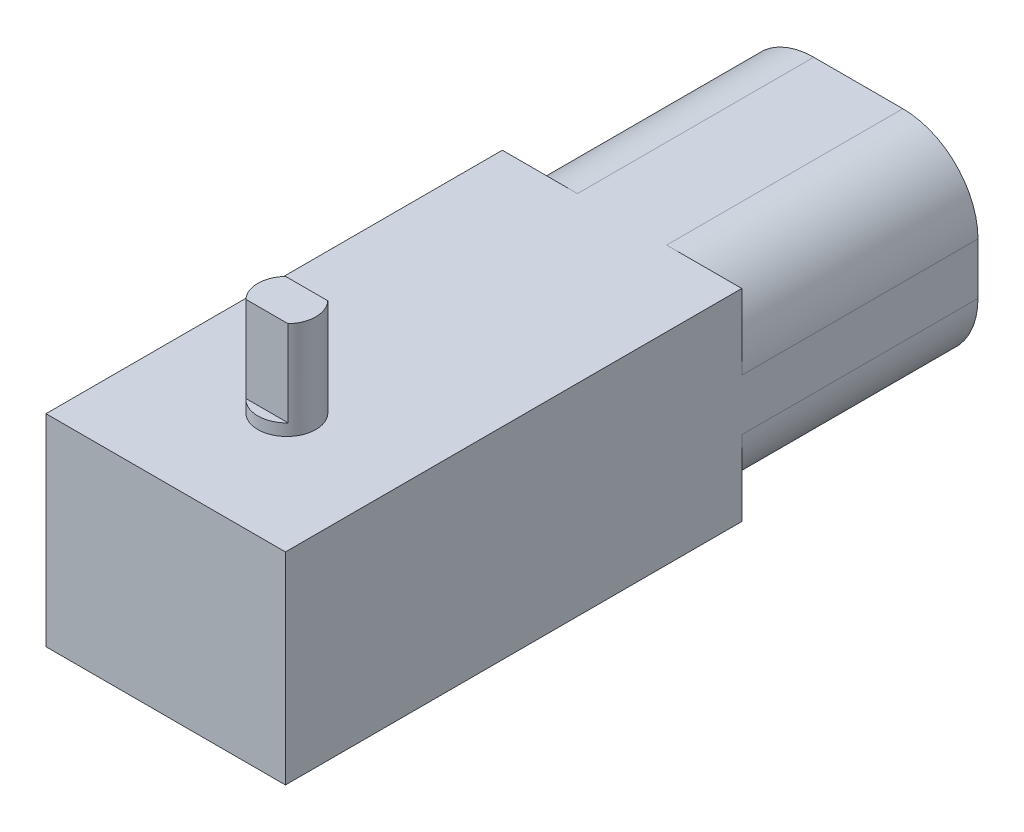
ISO-10303-21;
HEADER;
FILE_DESCRIPTION(('STEP AP214'),'2;1');
FILE_NAME('part.step','',(''),(''),'','','');
FILE_SCHEMA(('AUTOMOTIVE_DESIGN { 1 0 10303 214 1 1 1 1 }'));
ENDSEC;
DATA;
#1=APPLICATION_CONTEXT('core data for automotive mechanical design processes');
#2=APPLICATION_PROTOCOL_DEFINITION('international standard','automotive_design',2000,#1);
#3=PRODUCT_CONTEXT('',#1,'mechanical');
#4=PRODUCT('Part','Part','',(#3));
#5=PRODUCT_RELATED_PRODUCT_CATEGORY('part','',(#4));
#6=PRODUCT_DEFINITION_FORMATION('','',#4);
#7=PRODUCT_DEFINITION_CONTEXT('part definition',#1,'design');
#8=PRODUCT_DEFINITION('design','',#6,#7);
#9=PRODUCT_DEFINITION_SHAPE('','',#8);
#10=(LENGTH_UNIT() NAMED_UNIT(*) SI_UNIT(.MILLI.,.METRE.));
#11=(NAMED_UNIT(*) PLANE_ANGLE_UNIT() SI_UNIT($,.RADIAN.));
#12=(NAMED_UNIT(*) SI_UNIT($,.STERADIAN.) SOLID_ANGLE_UNIT());
#13=UNCERTAINTY_MEASURE_WITH_UNIT(LENGTH_MEASURE(1.E-05),#10,'distance_accuracy_value','');
#14=(GEOMETRIC_REPRESENTATION_CONTEXT(3) GLOBAL_UNCERTAINTY_ASSIGNED_CONTEXT((#13)) GLOBAL_UNIT_ASSIGNED_CONTEXT((#10,
#11,#12)) REPRESENTATION_CONTEXT('',''));
#15=CARTESIAN_POINT('',(0.,0.,0.));
#16=DIRECTION('',(0.,0.,1.));
#17=DIRECTION('',(1.,0.,0.));
#18=AXIS2_PLACEMENT_3D('',#15,#16,#17);
#19=CARTESIAN_POINT('',(-11.15,18.8,-32.25));
#20=DIRECTION('',(0.,0.,1.));
#21=DIRECTION('',(1.,0.,0.));
#22=AXIS2_PLACEMENT_3D('',#19,#20,#21);
#23=PLANE('',#22);
#24=DIRECTION('',(0.,-1.,0.));
#25=VECTOR('',#24,1.);
#26=CARTESIAN_POINT('',(-11.15,18.8,-32.25));
#27=LINE('',#26,#25);
#28=CARTESIAN_POINT('',(-11.15,11.8,-32.25));
#29=VERTEX_POINT('',#28);
#30=CARTESIAN_POINT('',(-11.15,7.00000000000005,-32.25));
#31=VERTEX_POINT('',#30);
#32=EDGE_CURVE('E265',#29,#31,#27,.T.);
#33=ORIENTED_EDGE('',*,*,#32,.F.);
#34=CARTESIAN_POINT('',(-4.15,11.8,-32.25));
#35=DIRECTION('',(0.,0.,-1.));
#36=DIRECTION('',(-1.,0.,0.));
#37=AXIS2_PLACEMENT_3D('',#34,#35,#36);
#38=CIRCLE('',#37,7.);
#39=CARTESIAN_POINT('',(-4.14999999999995,18.8,-32.25));
#40=VERTEX_POINT('',#39);
#41=EDGE_CURVE('E166',#40,#29,#38,.F.);
#42=ORIENTED_EDGE('',*,*,#41,.F.);
#43=DIRECTION('',(-1.,0.,0.));
#44=VECTOR('',#43,1.);
#45=CARTESIAN_POINT('',(-11.15,18.8,-32.25));
#46=LINE('',#45,#44);
#47=CARTESIAN_POINT('',(4.14999999999995,18.8,-32.25));
#48=VERTEX_POINT('',#47);
#49=EDGE_CURVE('E172',#48,#40,#46,.T.);
#50=ORIENTED_EDGE('',*,*,#49,.F.);
#51=CARTESIAN_POINT('',(4.15,11.8,-32.25));
#52=DIRECTION('',(0.,0.,-1.));
#53=DIRECTION('',(-1.,0.,0.));
#54=AXIS2_PLACEMENT_3D('',#51,#52,#53);
#55=CIRCLE('',#54,7.);
#56=CARTESIAN_POINT('',(11.15,11.8,-32.25));
#57=VERTEX_POINT('',#56);
#58=EDGE_CURVE('E194',#57,#48,#55,.F.);
#59=ORIENTED_EDGE('',*,*,#58,.F.);
#60=DIRECTION('',(0.,-1.,0.));
#61=VECTOR('',#60,1.);
#62=CARTESIAN_POINT('',(11.15,18.8,-32.25));
#63=LINE('',#62,#61);
#64=CARTESIAN_POINT('',(11.15,7.00000000000005,-32.25));
#65=VERTEX_POINT('',#64);
#66=EDGE_CURVE('E267',#57,#65,#63,.T.);
#67=ORIENTED_EDGE('',*,*,#66,.T.);
#68=CARTESIAN_POINT('',(4.15,7.,-32.25));
#69=DIRECTION('',(0.,0.,-1.));
#70=DIRECTION('',(-1.,0.,0.));
#71=AXIS2_PLACEMENT_3D('',#68,#69,#70);
#72=CIRCLE('',#71,7.);
#73=CARTESIAN_POINT('',(4.14999999999995,0.,-32.25));
#74=VERTEX_POINT('',#73);
#75=EDGE_CURVE('E181',#74,#65,#72,.F.);
#76=ORIENTED_EDGE('',*,*,#75,.F.);
#77=DIRECTION('',(-1.,0.,0.));
#78=VECTOR('',#77,1.);
#79=CARTESIAN_POINT('',(-11.15,0.,-32.25));
#80=LINE('',#79,#78);
#81=CARTESIAN_POINT('',(-4.14999999999995,0.,-32.25));
#82=VERTEX_POINT('',#81);
#83=EDGE_CURVE('E255',#74,#82,#80,.T.);
#84=ORIENTED_EDGE('',*,*,#83,.T.);
#85=CARTESIAN_POINT('',(-4.15,7.,-32.25));
#86=DIRECTION('',(0.,0.,-1.));
#87=DIRECTION('',(-1.,0.,0.));
#88=AXIS2_PLACEMENT_3D('',#85,#86,#87);
#89=CIRCLE('',#88,7.);
#90=EDGE_CURVE('E174',#31,#82,#89,.F.);
#91=ORIENTED_EDGE('',*,*,#90,.F.);
#92=EDGE_LOOP('',(#33,#42,#50,#59,#67,#76,#84,#91));
#93=FACE_BOUND('',#92,.T.);
#94=ADVANCED_FACE('F37',(#93),#23,.F.);
#95=CARTESIAN_POINT('',(11.15,18.8,-32.25));
#96=DIRECTION('',(-1.,0.,0.));
#97=DIRECTION('',(0.,0.,1.));
#98=AXIS2_PLACEMENT_3D('',#95,#96,#97);
#99=PLANE('',#98);
#100=DIRECTION('',(0.,0.,-1.));
#101=VECTOR('',#100,1.);
#102=CARTESIAN_POINT('',(11.15,7.00000000000005,-10.25));
#103=LINE('',#102,#101);
#104=CARTESIAN_POINT('',(11.15,7.00000000000005,-10.25));
#105=VERTEX_POINT('',#104);
#106=EDGE_CURVE('E188',#105,#65,#103,.T.);
#107=ORIENTED_EDGE('',*,*,#106,.T.);
#108=ORIENTED_EDGE('',*,*,#66,.F.);
#109=DIRECTION('',(0.,0.,-1.));
#110=VECTOR('',#109,1.);
#111=CARTESIAN_POINT('',(11.15,11.8,-10.25));
#112=LINE('',#111,#110);
#113=CARTESIAN_POINT('',(11.15,11.8,-10.25));
#114=VERTEX_POINT('',#113);
#115=EDGE_CURVE('E198',#114,#57,#112,.T.);
#116=ORIENTED_EDGE('',*,*,#115,.F.);
#117=DIRECTION('',(0.,-1.,0.));
#118=VECTOR('',#117,1.);
#119=CARTESIAN_POINT('',(11.15,0.,-10.25));
#120=LINE('',#119,#118);
#121=CARTESIAN_POINT('',(11.15,18.8,-10.25));
#122=VERTEX_POINT('',#121);
#123=EDGE_CURVE('E192',#122,#114,#120,.T.);
#124=ORIENTED_EDGE('',*,*,#123,.F.);
#125=DIRECTION('',(0.,0.,-1.));
#126=VECTOR('',#125,1.);
#127=CARTESIAN_POINT('',(11.15,18.8,-32.25));
#128=LINE('',#127,#126);
#129=CARTESIAN_POINT('',(11.15,18.8,32.25));
#130=VERTEX_POINT('',#129);
#131=EDGE_CURVE('E243',#130,#122,#128,.T.);
#132=ORIENTED_EDGE('',*,*,#131,.F.);
#133=DIRECTION('',(0.,-1.,0.));
#134=VECTOR('',#133,1.);
#135=CARTESIAN_POINT('',(11.15,18.8,32.25));
#136=LINE('',#135,#134);
#137=CARTESIAN_POINT('',(11.15,0.,32.25));
#138=VERTEX_POINT('',#137);
#139=EDGE_CURVE('E252',#130,#138,#136,.T.);
#140=ORIENTED_EDGE('',*,*,#139,.T.);
#141=DIRECTION('',(0.,0.,-1.));
#142=VECTOR('',#141,1.);
#143=CARTESIAN_POINT('',(11.15,0.,-32.25));
#144=LINE('',#143,#142);
#145=CARTESIAN_POINT('',(11.15,0.,-10.25));
#146=VERTEX_POINT('',#145);
#147=EDGE_CURVE('E239',#138,#146,#144,.T.);
#148=ORIENTED_EDGE('',*,*,#147,.T.);
#149=DIRECTION('',(0.,-1.,0.));
#150=VECTOR('',#149,1.);
#151=CARTESIAN_POINT('',(11.15,0.,-10.25));
#152=LINE('',#151,#150);
#153=EDGE_CURVE('E183',#105,#146,#152,.T.);
#154=ORIENTED_EDGE('',*,*,#153,.F.);
#155=EDGE_LOOP('',(#107,#108,#116,#124,#132,#140,#148,#154));
#156=FACE_BOUND('',#155,.T.);
#157=ADVANCED_FACE('F39',(#156),#99,.F.);
#158=CARTESIAN_POINT('',(-11.15,18.8,-32.25));
#159=DIRECTION('',(1.,0.,0.));
#160=DIRECTION('',(0.,0.,-1.));
#161=AXIS2_PLACEMENT_3D('',#158,#159,#160);
#162=PLANE('',#161);
#163=DIRECTION('',(0.,0.,-1.));
#164=VECTOR('',#163,1.);
#165=CARTESIAN_POINT('',(-11.15,11.8,-10.25));
#166=LINE('',#165,#164);
#167=CARTESIAN_POINT('',(-11.15,11.8,-10.25));
#168=VERTEX_POINT('',#167);
#169=EDGE_CURVE('E156',#168,#29,#166,.T.);
#170=ORIENTED_EDGE('',*,*,#169,.T.);
#171=ORIENTED_EDGE('',*,*,#32,.T.);
#172=DIRECTION('',(0.,0.,-1.));
#173=VECTOR('',#172,1.);
#174=CARTESIAN_POINT('',(-11.15,7.00000000000005,-10.25));
#175=LINE('',#174,#173);
#176=CARTESIAN_POINT('',(-11.15,7.00000000000005,-10.25));
#177=VERTEX_POINT('',#176);
#178=EDGE_CURVE('E209',#177,#31,#175,.T.);
#179=ORIENTED_EDGE('',*,*,#178,.F.);
#180=DIRECTION('',(0.,1.,0.));
#181=VECTOR('',#180,1.);
#182=CARTESIAN_POINT('',(-11.15,0.,-10.25));
#183=LINE('',#182,#181);
#184=CARTESIAN_POINT('',(-11.15,0.,-10.25));
#185=VERTEX_POINT('',#184);
#186=EDGE_CURVE('E202',#185,#177,#183,.T.);
#187=ORIENTED_EDGE('',*,*,#186,.F.);
#188=DIRECTION('',(0.,0.,1.));
#189=VECTOR('',#188,1.);
#190=CARTESIAN_POINT('',(-11.15,0.,-32.25));
#191=LINE('',#190,#189);
#192=CARTESIAN_POINT('',(-11.15,0.,32.25));
#193=VERTEX_POINT('',#192);
#194=EDGE_CURVE('E257',#185,#193,#191,.T.);
#195=ORIENTED_EDGE('',*,*,#194,.T.);
#196=DIRECTION('',(0.,-1.,0.));
#197=VECTOR('',#196,1.);
#198=CARTESIAN_POINT('',(-11.15,18.8,32.25));
#199=LINE('',#198,#197);
#200=CARTESIAN_POINT('',(-11.15,18.8,32.25));
#201=VERTEX_POINT('',#200);
#202=EDGE_CURVE('E262',#201,#193,#199,.T.);
#203=ORIENTED_EDGE('',*,*,#202,.F.);
#204=DIRECTION('',(0.,0.,1.));
#205=VECTOR('',#204,1.);
#206=CARTESIAN_POINT('',(-11.15,18.8,-32.25));
#207=LINE('',#206,#205);
#208=CARTESIAN_POINT('',(-11.15,18.8,-10.25));
#209=VERTEX_POINT('',#208);
#210=EDGE_CURVE('E248',#209,#201,#207,.T.);
#211=ORIENTED_EDGE('',*,*,#210,.F.);
#212=DIRECTION('',(0.,1.,0.));
#213=VECTOR('',#212,1.);
#214=CARTESIAN_POINT('',(-11.15,0.,-10.25));
#215=LINE('',#214,#213);
#216=EDGE_CURVE('E159',#168,#209,#215,.T.);
#217=ORIENTED_EDGE('',*,*,#216,.F.);
#218=EDGE_LOOP('',(#170,#171,#179,#187,#195,#203,#211,#217));
#219=FACE_BOUND('',#218,.T.);
#220=ADVANCED_FACE('F307',(#219),#162,.F.);
#221=CARTESIAN_POINT('',(0.,18.8,0.));
#222=DIRECTION('',(0.,1.,0.));
#223=DIRECTION('',(0.,0.,1.));
#224=AXIS2_PLACEMENT_3D('',#221,#222,#223);
#225=PLANE('',#224);
#226=CARTESIAN_POINT('',(0.,18.8,20.97));
#227=DIRECTION('',(0.,1.,0.));
#228=DIRECTION('',(0.,0.,1.));
#229=AXIS2_PLACEMENT_3D('',#226,#227,#228);
#230=CIRCLE('',#229,2.7);
#231=CARTESIAN_POINT('',(0.,18.8,23.67));
#232=VERTEX_POINT('',#231);
#233=EDGE_CURVE('E235',#232,#232,#230,.T.);
#234=ORIENTED_EDGE('',*,*,#233,.F.);
#235=EDGE_LOOP('',(#234));
#236=FACE_BOUND('',#235,.T.);
#237=ORIENTED_EDGE('',*,*,#49,.T.);
#238=DIRECTION('',(0.,0.,-1.));
#239=VECTOR('',#238,1.);
#240=CARTESIAN_POINT('',(-4.14999999999995,18.8,-10.25));
#241=LINE('',#240,#239);
#242=CARTESIAN_POINT('',(-4.14999999999995,18.8,-10.25));
#243=VERTEX_POINT('',#242);
#244=EDGE_CURVE('E153',#243,#40,#241,.T.);
#245=ORIENTED_EDGE('',*,*,#244,.F.);
#246=DIRECTION('',(1.,0.,0.));
#247=VECTOR('',#246,1.);
#248=CARTESIAN_POINT('',(0.,18.8,-10.25));
#249=LINE('',#248,#247);
#250=EDGE_CURVE('E160',#209,#243,#249,.T.);
#251=ORIENTED_EDGE('',*,*,#250,.F.);
#252=ORIENTED_EDGE('',*,*,#210,.T.);
#253=DIRECTION('',(1.,0.,0.));
#254=VECTOR('',#253,1.);
#255=CARTESIAN_POINT('',(-11.15,18.8,32.25));
#256=LINE('',#255,#254);
#257=EDGE_CURVE('E250',#201,#130,#256,.T.);
#258=ORIENTED_EDGE('',*,*,#257,.T.);
#259=ORIENTED_EDGE('',*,*,#131,.T.);
#260=DIRECTION('',(1.,0.,0.));
#261=VECTOR('',#260,1.);
#262=CARTESIAN_POINT('',(0.,18.8,-10.25));
#263=LINE('',#262,#261);
#264=CARTESIAN_POINT('',(4.14999999999995,18.8,-10.25));
#265=VERTEX_POINT('',#264);
#266=EDGE_CURVE('E196',#265,#122,#263,.T.);
#267=ORIENTED_EDGE('',*,*,#266,.F.);
#268=DIRECTION('',(0.,0.,-1.));
#269=VECTOR('',#268,1.);
#270=CARTESIAN_POINT('',(4.14999999999995,18.8,-10.25));
#271=LINE('',#270,#269);
#272=EDGE_CURVE('E187',#265,#48,#271,.T.);
#273=ORIENTED_EDGE('',*,*,#272,.T.);
#274=EDGE_LOOP('',(#237,#245,#251,#252,#258,#259,#267,#273));
#275=FACE_BOUND('',#274,.T.);
#276=ADVANCED_FACE('F169',(#236,#275),#225,.T.);
#277=CARTESIAN_POINT('',(0.,0.,0.));
#278=DIRECTION('',(0.,1.,0.));
#279=DIRECTION('',(0.,0.,1.));
#280=AXIS2_PLACEMENT_3D('',#277,#278,#279);
#281=PLANE('',#280);
#282=ORIENTED_EDGE('',*,*,#83,.F.);
#283=DIRECTION('',(0.,0.,-1.));
#284=VECTOR('',#283,1.);
#285=CARTESIAN_POINT('',(4.14999999999995,0.,-10.25));
#286=LINE('',#285,#284);
#287=CARTESIAN_POINT('',(4.14999999999995,0.,-10.25));
#288=VERTEX_POINT('',#287);
#289=EDGE_CURVE('E185',#288,#74,#286,.T.);
#290=ORIENTED_EDGE('',*,*,#289,.F.);
#291=DIRECTION('',(-1.,0.,0.));
#292=VECTOR('',#291,1.);
#293=CARTESIAN_POINT('',(0.,0.,-10.25));
#294=LINE('',#293,#292);
#295=EDGE_CURVE('E179',#146,#288,#294,.T.);
#296=ORIENTED_EDGE('',*,*,#295,.F.);
#297=ORIENTED_EDGE('',*,*,#147,.F.);
#298=DIRECTION('',(1.,0.,0.));
#299=VECTOR('',#298,1.);
#300=CARTESIAN_POINT('',(-11.15,0.,32.25));
#301=LINE('',#300,#299);
#302=EDGE_CURVE('E246',#193,#138,#301,.T.);
#303=ORIENTED_EDGE('',*,*,#302,.F.);
#304=ORIENTED_EDGE('',*,*,#194,.F.);
#305=DIRECTION('',(-1.,0.,0.));
#306=VECTOR('',#305,1.);
#307=CARTESIAN_POINT('',(0.,0.,-10.25));
#308=LINE('',#307,#306);
#309=CARTESIAN_POINT('',(-4.14999999999995,0.,-10.25));
#310=VERTEX_POINT('',#309);
#311=EDGE_CURVE('E207',#310,#185,#308,.T.);
#312=ORIENTED_EDGE('',*,*,#311,.F.);
#313=DIRECTION('',(0.,0.,-1.));
#314=VECTOR('',#313,1.);
#315=CARTESIAN_POINT('',(-4.14999999999995,0.,-10.25));
#316=LINE('',#315,#314);
#317=EDGE_CURVE('E212',#310,#82,#316,.T.);
#318=ORIENTED_EDGE('',*,*,#317,.T.);
#319=EDGE_LOOP('',(#282,#290,#296,#297,#303,#304,#312,#318));
#320=FACE_BOUND('',#319,.T.);
#321=ADVANCED_FACE('F317',(#320),#281,.F.);
#322=CARTESIAN_POINT('',(-11.15,18.8,32.25));
#323=DIRECTION('',(0.,0.,-1.));
#324=DIRECTION('',(-1.,0.,0.));
#325=AXIS2_PLACEMENT_3D('',#322,#323,#324);
#326=PLANE('',#325);
#327=ORIENTED_EDGE('',*,*,#302,.T.);
#328=ORIENTED_EDGE('',*,*,#139,.F.);
#329=ORIENTED_EDGE('',*,*,#257,.F.);
#330=ORIENTED_EDGE('',*,*,#202,.T.);
#331=EDGE_LOOP('',(#327,#328,#329,#330));
#332=FACE_BOUND('',#331,.T.);
#333=ADVANCED_FACE('F314',(#332),#326,.F.);
#334=CARTESIAN_POINT('',(0.,27.9,20.97));
#335=DIRECTION('',(0.,-1.,0.));
#336=DIRECTION('',(0.,0.,-1.));
#337=AXIS2_PLACEMENT_3D('',#334,#335,#336);
#338=CYLINDRICAL_SURFACE('',#337,2.7);
#339=CARTESIAN_POINT('',(0.,27.9,20.97));
#340=DIRECTION('',(0.,1.,0.));
#341=DIRECTION('',(0.,0.,1.));
#342=AXIS2_PLACEMENT_3D('',#339,#340,#341);
#343=CIRCLE('',#342,2.7);
#344=CARTESIAN_POINT('',(-1.96659604392972,27.9,19.12));
#345=VERTEX_POINT('',#344);
#346=CARTESIAN_POINT('',(-1.96659604392971,27.9,22.82));
#347=VERTEX_POINT('',#346);
#348=EDGE_CURVE('E240',#345,#347,#343,.T.);
#349=ORIENTED_EDGE('',*,*,#348,.F.);
#350=DIRECTION('',(0.,-1.,0.));
#351=VECTOR('',#350,1.);
#352=CARTESIAN_POINT('',(-1.96659604392972,27.9,19.12));
#353=LINE('',#352,#351);
#354=CARTESIAN_POINT('',(-1.96659604392972,19.9,19.12));
#355=VERTEX_POINT('',#354);
#356=EDGE_CURVE('E223',#345,#355,#353,.T.);
#357=ORIENTED_EDGE('',*,*,#356,.T.);
#358=CARTESIAN_POINT('',(0.,19.9,20.97));
#359=DIRECTION('',(0.,-1.,0.));
#360=DIRECTION('',(0.,0.,-1.));
#361=AXIS2_PLACEMENT_3D('',#358,#359,#360);
#362=CIRCLE('',#361,2.7);
#363=CARTESIAN_POINT('',(1.96659604392972,19.9,19.12));
#364=VERTEX_POINT('',#363);
#365=EDGE_CURVE('E11',#355,#364,#362,.T.);
#366=ORIENTED_EDGE('',*,*,#365,.T.);
#367=DIRECTION('',(0.,-1.,0.));
#368=VECTOR('',#367,1.);
#369=CARTESIAN_POINT('',(1.96659604392972,27.9,19.12));
#370=LINE('',#369,#368);
#371=CARTESIAN_POINT('',(1.96659604392971,27.9,19.12));
#372=VERTEX_POINT('',#371);
#373=EDGE_CURVE('E220',#364,#372,#370,.F.);
#374=ORIENTED_EDGE('',*,*,#373,.T.);
#375=CARTESIAN_POINT('',(1.96659604392971,27.9,22.82));
#376=VERTEX_POINT('',#375);
#377=EDGE_CURVE('E236',#376,#372,#343,.T.);
#378=ORIENTED_EDGE('',*,*,#377,.F.);
#379=DIRECTION('',(0.,-1.,0.));
#380=VECTOR('',#379,1.);
#381=CARTESIAN_POINT('',(1.96659604392971,27.9,22.82));
#382=LINE('',#381,#380);
#383=CARTESIAN_POINT('',(1.96659604392971,19.9,22.82));
#384=VERTEX_POINT('',#383);
#385=EDGE_CURVE('E232',#376,#384,#382,.T.);
#386=ORIENTED_EDGE('',*,*,#385,.T.);
#387=CARTESIAN_POINT('',(0.,19.9,20.97));
#388=DIRECTION('',(0.,-1.,0.));
#389=DIRECTION('',(0.,0.,-1.));
#390=AXIS2_PLACEMENT_3D('',#387,#388,#389);
#391=CIRCLE('',#390,2.7);
#392=CARTESIAN_POINT('',(-1.96659604392971,19.9,22.82));
#393=VERTEX_POINT('',#392);
#394=EDGE_CURVE('E273',#384,#393,#391,.T.);
#395=ORIENTED_EDGE('',*,*,#394,.T.);
#396=DIRECTION('',(0.,-1.,0.));
#397=VECTOR('',#396,1.);
#398=CARTESIAN_POINT('',(-1.96659604392971,27.9,22.82));
#399=LINE('',#398,#397);
#400=EDGE_CURVE('E229',#393,#347,#399,.F.);
#401=ORIENTED_EDGE('',*,*,#400,.T.);
#402=EDGE_LOOP('',(#349,#357,#366,#374,#378,#386,#395,#401));
#403=FACE_BOUND('',#402,.T.);
#404=ORIENTED_EDGE('',*,*,#233,.T.);
#405=EDGE_LOOP('',(#404));
#406=FACE_BOUND('',#405,.T.);
#407=ADVANCED_FACE('F283',(#403,#406),#338,.T.);
#408=CARTESIAN_POINT('',(0.,27.9,20.97));
#409=DIRECTION('',(0.,1.,0.));
#410=DIRECTION('',(0.,0.,1.));
#411=AXIS2_PLACEMENT_3D('',#408,#409,#410);
#412=PLANE('',#411);
#413=DIRECTION('',(1.,0.,0.));
#414=VECTOR('',#413,1.);
#415=CARTESIAN_POINT('',(0.,27.9,19.12));
#416=LINE('',#415,#414);
#417=EDGE_CURVE('E45',#345,#372,#416,.T.);
#418=ORIENTED_EDGE('',*,*,#417,.F.);
#419=ORIENTED_EDGE('',*,*,#348,.T.);
#420=DIRECTION('',(-1.,0.,0.));
#421=VECTOR('',#420,1.);
#422=CARTESIAN_POINT('',(0.,27.9,22.82));
#423=LINE('',#422,#421);
#424=EDGE_CURVE('E270',#376,#347,#423,.T.);
#425=ORIENTED_EDGE('',*,*,#424,.F.);
#426=ORIENTED_EDGE('',*,*,#377,.T.);
#427=EDGE_LOOP('',(#418,#419,#425,#426));
#428=FACE_BOUND('',#427,.T.);
#429=ADVANCED_FACE('F286',(#428),#412,.T.);
#430=CARTESIAN_POINT('',(0.,19.9,0.));
#431=DIRECTION('',(0.,-1.,0.));
#432=DIRECTION('',(0.,0.,-1.));
#433=AXIS2_PLACEMENT_3D('',#430,#431,#432);
#434=PLANE('',#433);
#435=DIRECTION('',(-1.,0.,0.));
#436=VECTOR('',#435,1.);
#437=CARTESIAN_POINT('',(-3.85451514798373,19.9,22.82));
#438=LINE('',#437,#436);
#439=EDGE_CURVE('E226',#384,#393,#438,.T.);
#440=ORIENTED_EDGE('',*,*,#439,.T.);
#441=ORIENTED_EDGE('',*,*,#394,.F.);
#442=EDGE_LOOP('',(#440,#441));
#443=FACE_BOUND('',#442,.T.);
#444=ADVANCED_FACE('F291',(#443),#434,.F.);
#445=CARTESIAN_POINT('',(-3.85451514798373,19.9,22.82));
#446=DIRECTION('',(0.,0.,-1.));
#447=DIRECTION('',(-1.,0.,0.));
#448=AXIS2_PLACEMENT_3D('',#445,#446,#447);
#449=PLANE('',#448);
#450=ORIENTED_EDGE('',*,*,#424,.T.);
#451=ORIENTED_EDGE('',*,*,#400,.F.);
#452=ORIENTED_EDGE('',*,*,#439,.F.);
#453=ORIENTED_EDGE('',*,*,#385,.F.);
#454=EDGE_LOOP('',(#450,#451,#452,#453));
#455=FACE_BOUND('',#454,.T.);
#456=ADVANCED_FACE('F288',(#455),#449,.F.);
#457=CARTESIAN_POINT('',(0.,19.9,0.));
#458=DIRECTION('',(0.,-1.,0.));
#459=DIRECTION('',(0.,0.,-1.));
#460=AXIS2_PLACEMENT_3D('',#457,#458,#459);
#461=PLANE('',#460);
#462=DIRECTION('',(1.,0.,0.));
#463=VECTOR('',#462,1.);
#464=CARTESIAN_POINT('',(-3.85451514798373,19.9,19.12));
#465=LINE('',#464,#463);
#466=EDGE_CURVE('E215',#355,#364,#465,.T.);
#467=ORIENTED_EDGE('',*,*,#466,.T.);
#468=ORIENTED_EDGE('',*,*,#365,.F.);
#469=EDGE_LOOP('',(#467,#468));
#470=FACE_BOUND('',#469,.T.);
#471=ADVANCED_FACE('F298',(#470),#461,.F.);
#472=CARTESIAN_POINT('',(-3.85451514798373,19.9,19.12));
#473=DIRECTION('',(0.,0.,1.));
#474=DIRECTION('',(1.,0.,0.));
#475=AXIS2_PLACEMENT_3D('',#472,#473,#474);
#476=PLANE('',#475);
#477=ORIENTED_EDGE('',*,*,#417,.T.);
#478=ORIENTED_EDGE('',*,*,#373,.F.);
#479=ORIENTED_EDGE('',*,*,#466,.F.);
#480=ORIENTED_EDGE('',*,*,#356,.F.);
#481=EDGE_LOOP('',(#477,#478,#479,#480));
#482=FACE_BOUND('',#481,.T.);
#483=ADVANCED_FACE('F277',(#482),#476,.F.);
#484=CARTESIAN_POINT('',(-4.15,7.,-10.25));
#485=DIRECTION('',(0.,0.,-1.));
#486=DIRECTION('',(-1.,0.,0.));
#487=AXIS2_PLACEMENT_3D('',#484,#485,#486);
#488=CYLINDRICAL_SURFACE('',#487,7.);
#489=ORIENTED_EDGE('',*,*,#90,.T.);
#490=ORIENTED_EDGE('',*,*,#317,.F.);
#491=CARTESIAN_POINT('',(-4.15,7.,-10.25));
#492=DIRECTION('',(0.,0.,-1.));
#493=DIRECTION('',(-1.,0.,0.));
#494=AXIS2_PLACEMENT_3D('',#491,#492,#493);
#495=CIRCLE('',#494,7.);
#496=EDGE_CURVE('E205',#177,#310,#495,.F.);
#497=ORIENTED_EDGE('',*,*,#496,.F.);
#498=ORIENTED_EDGE('',*,*,#178,.T.);
#499=EDGE_LOOP('',(#489,#490,#497,#498));
#500=FACE_BOUND('',#499,.T.);
#501=ADVANCED_FACE('F361',(#500),#488,.T.);
#502=CARTESIAN_POINT('',(0.,0.,-10.25));
#503=DIRECTION('',(0.,0.,-1.));
#504=DIRECTION('',(-1.,0.,0.));
#505=AXIS2_PLACEMENT_3D('',#502,#503,#504);
#506=PLANE('',#505);
#507=ORIENTED_EDGE('',*,*,#186,.T.);
#508=ORIENTED_EDGE('',*,*,#496,.T.);
#509=ORIENTED_EDGE('',*,*,#311,.T.);
#510=EDGE_LOOP('',(#507,#508,#509));
#511=FACE_BOUND('',#510,.T.);
#512=ADVANCED_FACE('F398',(#511),#506,.T.);
#513=CARTESIAN_POINT('',(4.15,11.8,-10.25));
#514=DIRECTION('',(0.,0.,-1.));
#515=DIRECTION('',(-1.,0.,0.));
#516=AXIS2_PLACEMENT_3D('',#513,#514,#515);
#517=CYLINDRICAL_SURFACE('',#516,7.);
#518=ORIENTED_EDGE('',*,*,#58,.T.);
#519=ORIENTED_EDGE('',*,*,#272,.F.);
#520=CARTESIAN_POINT('',(4.15,11.8,-10.25));
#521=DIRECTION('',(0.,0.,-1.));
#522=DIRECTION('',(-1.,0.,0.));
#523=AXIS2_PLACEMENT_3D('',#520,#521,#522);
#524=CIRCLE('',#523,7.);
#525=EDGE_CURVE('E60',#114,#265,#524,.F.);
#526=ORIENTED_EDGE('',*,*,#525,.F.);
#527=ORIENTED_EDGE('',*,*,#115,.T.);
#528=EDGE_LOOP('',(#518,#519,#526,#527));
#529=FACE_BOUND('',#528,.T.);
#530=ADVANCED_FACE('F408',(#529),#517,.T.);
#531=CARTESIAN_POINT('',(0.,0.,-10.25));
#532=DIRECTION('',(0.,0.,-1.));
#533=DIRECTION('',(-1.,0.,0.));
#534=AXIS2_PLACEMENT_3D('',#531,#532,#533);
#535=PLANE('',#534);
#536=ORIENTED_EDGE('',*,*,#123,.T.);
#537=ORIENTED_EDGE('',*,*,#525,.T.);
#538=ORIENTED_EDGE('',*,*,#266,.T.);
#539=EDGE_LOOP('',(#536,#537,#538));
#540=FACE_BOUND('',#539,.T.);
#541=ADVANCED_FACE('F418',(#540),#535,.T.);
#542=CARTESIAN_POINT('',(-4.15,11.8,-10.25));
#543=DIRECTION('',(0.,0.,-1.));
#544=DIRECTION('',(-1.,0.,0.));
#545=AXIS2_PLACEMENT_3D('',#542,#543,#544);
#546=CYLINDRICAL_SURFACE('',#545,7.);
#547=ORIENTED_EDGE('',*,*,#41,.T.);
#548=ORIENTED_EDGE('',*,*,#169,.F.);
#549=CARTESIAN_POINT('',(-4.15,11.8,-10.25));
#550=DIRECTION('',(0.,0.,-1.));
#551=DIRECTION('',(-1.,0.,0.));
#552=AXIS2_PLACEMENT_3D('',#549,#550,#551);
#553=CIRCLE('',#552,7.);
#554=EDGE_CURVE('E149',#243,#168,#553,.F.);
#555=ORIENTED_EDGE('',*,*,#554,.F.);
#556=ORIENTED_EDGE('',*,*,#244,.T.);
#557=EDGE_LOOP('',(#547,#548,#555,#556));
#558=FACE_BOUND('',#557,.T.);
#559=ADVANCED_FACE('F151',(#558),#546,.T.);
#560=CARTESIAN_POINT('',(0.,0.,-10.25));
#561=DIRECTION('',(0.,0.,-1.));
#562=DIRECTION('',(-1.,0.,0.));
#563=AXIS2_PLACEMENT_3D('',#560,#561,#562);
#564=PLANE('',#563);
#565=ORIENTED_EDGE('',*,*,#250,.T.);
#566=ORIENTED_EDGE('',*,*,#554,.T.);
#567=ORIENTED_EDGE('',*,*,#216,.T.);
#568=EDGE_LOOP('',(#565,#566,#567));
#569=FACE_BOUND('',#568,.T.);
#570=ADVANCED_FACE('F163',(#569),#564,.T.);
#571=CARTESIAN_POINT('',(4.15,7.,-10.25));
#572=DIRECTION('',(0.,0.,-1.));
#573=DIRECTION('',(-1.,0.,0.));
#574=AXIS2_PLACEMENT_3D('',#571,#572,#573);
#575=CYLINDRICAL_SURFACE('',#574,7.);
#576=ORIENTED_EDGE('',*,*,#75,.T.);
#577=ORIENTED_EDGE('',*,*,#106,.F.);
#578=CARTESIAN_POINT('',(4.15,7.,-10.25));
#579=DIRECTION('',(0.,0.,-1.));
#580=DIRECTION('',(-1.,0.,0.));
#581=AXIS2_PLACEMENT_3D('',#578,#579,#580);
#582=CIRCLE('',#581,7.);
#583=EDGE_CURVE('E52',#288,#105,#582,.F.);
#584=ORIENTED_EDGE('',*,*,#583,.F.);
#585=ORIENTED_EDGE('',*,*,#289,.T.);
#586=EDGE_LOOP('',(#576,#577,#584,#585));
#587=FACE_BOUND('',#586,.T.);
#588=ADVANCED_FACE('F444',(#587),#575,.T.);
#589=CARTESIAN_POINT('',(0.,0.,-10.25));
#590=DIRECTION('',(0.,0.,-1.));
#591=DIRECTION('',(-1.,0.,0.));
#592=AXIS2_PLACEMENT_3D('',#589,#590,#591);
#593=PLANE('',#592);
#594=ORIENTED_EDGE('',*,*,#295,.T.);
#595=ORIENTED_EDGE('',*,*,#583,.T.);
#596=ORIENTED_EDGE('',*,*,#153,.T.);
#597=EDGE_LOOP('',(#594,#595,#596));
#598=FACE_BOUND('',#597,.T.);
#599=ADVANCED_FACE('F453',(#598),#593,.T.);
#600=CLOSED_SHELL('',(#94,#157,#220,#276,#321,#333,#407,#429,#444,#456,#471,#483,#501,#512,#530,
#541,#559,#570,#588,#599));
#601=MANIFOLD_SOLID_BREP('B2',#600);
#602=ADVANCED_BREP_SHAPE_REPRESENTATION('',(#18,#601),#14);
#603=SHAPE_DEFINITION_REPRESENTATION(#9,#602);
ENDSEC;
END-ISO-10303-21;
